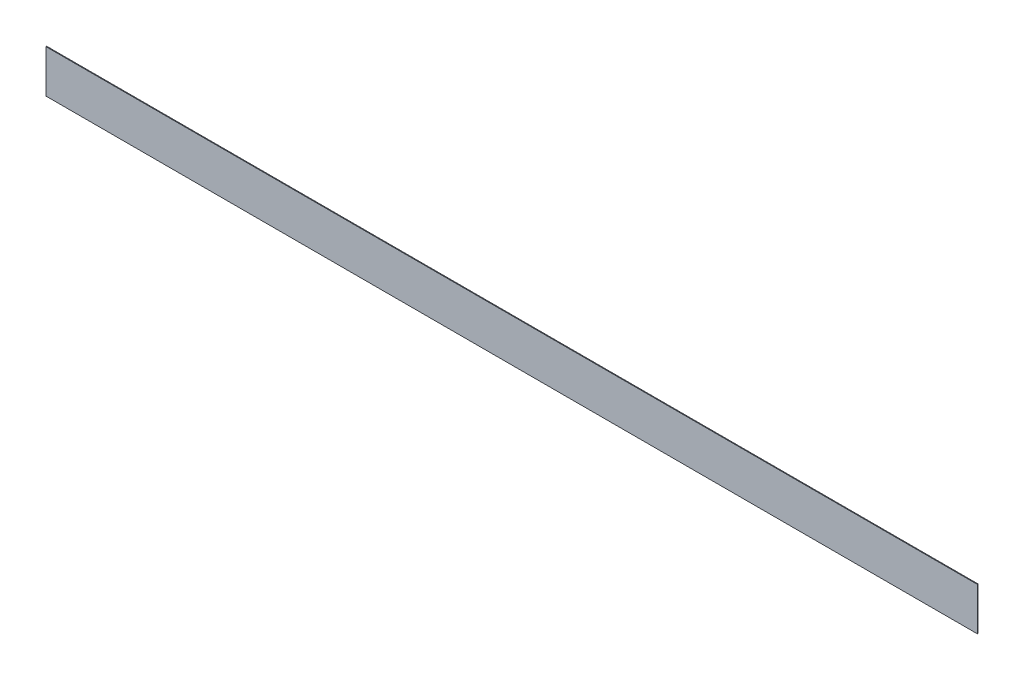
ISO-10303-21;
HEADER;
FILE_DESCRIPTION(('STEP AP214'),'2;1');
FILE_NAME('part.step','',(''),(''),'','','');
FILE_SCHEMA(('AUTOMOTIVE_DESIGN { 1 0 10303 214 1 1 1 1 }'));
ENDSEC;
DATA;
#1=APPLICATION_CONTEXT('core data for automotive mechanical design processes');
#2=APPLICATION_PROTOCOL_DEFINITION('international standard','automotive_design',2000,#1);
#3=PRODUCT_CONTEXT('',#1,'mechanical');
#4=PRODUCT('Part','Part','',(#3));
#5=PRODUCT_RELATED_PRODUCT_CATEGORY('part','',(#4));
#6=PRODUCT_DEFINITION_FORMATION('','',#4);
#7=PRODUCT_DEFINITION_CONTEXT('part definition',#1,'design');
#8=PRODUCT_DEFINITION('design','',#6,#7);
#9=PRODUCT_DEFINITION_SHAPE('','',#8);
#10=(LENGTH_UNIT() NAMED_UNIT(*) SI_UNIT(.MILLI.,.METRE.));
#11=(NAMED_UNIT(*) PLANE_ANGLE_UNIT() SI_UNIT($,.RADIAN.));
#12=(NAMED_UNIT(*) SI_UNIT($,.STERADIAN.) SOLID_ANGLE_UNIT());
#13=UNCERTAINTY_MEASURE_WITH_UNIT(LENGTH_MEASURE(1.E-05),#10,'distance_accuracy_value','');
#14=(GEOMETRIC_REPRESENTATION_CONTEXT(3) GLOBAL_UNCERTAINTY_ASSIGNED_CONTEXT((#13)) GLOBAL_UNIT_ASSIGNED_CONTEXT((#10,
#11,#12)) REPRESENTATION_CONTEXT('',''));
#15=CARTESIAN_POINT('',(0.,0.,0.));
#16=DIRECTION('',(0.,0.,1.));
#17=DIRECTION('',(1.,0.,0.));
#18=AXIS2_PLACEMENT_3D('',#15,#16,#17);
#19=CARTESIAN_POINT('',(2500.,115.,2.));
#20=DIRECTION('',(0.,-1.,0.));
#21=DIRECTION('',(1.,0.,0.));
#22=AXIS2_PLACEMENT_3D('',#19,#20,#21);
#23=PLANE('',#22);
#24=DIRECTION('',(-1.,0.,0.));
#25=VECTOR('',#24,1.);
#26=CARTESIAN_POINT('',(2500.,115.,0.));
#27=LINE('',#26,#25);
#28=CARTESIAN_POINT('',(2500.,115.,0.));
#29=VERTEX_POINT('',#28);
#30=CARTESIAN_POINT('',(0.,115.,0.));
#31=VERTEX_POINT('',#30);
#32=EDGE_CURVE('E109',#29,#31,#27,.T.);
#33=ORIENTED_EDGE('',*,*,#32,.T.);
#34=DIRECTION('',(0.,0.,-1.));
#35=VECTOR('',#34,1.);
#36=CARTESIAN_POINT('',(0.,115.,2.));
#37=LINE('',#36,#35);
#38=CARTESIAN_POINT('',(0.,115.,2.));
#39=VERTEX_POINT('',#38);
#40=EDGE_CURVE('E11',#39,#31,#37,.T.);
#41=ORIENTED_EDGE('',*,*,#40,.F.);
#42=DIRECTION('',(-1.,0.,0.));
#43=VECTOR('',#42,1.);
#44=CARTESIAN_POINT('',(2500.,115.,2.));
#45=LINE('',#44,#43);
#46=CARTESIAN_POINT('',(2500.,115.,2.));
#47=VERTEX_POINT('',#46);
#48=EDGE_CURVE('E93',#47,#39,#45,.T.);
#49=ORIENTED_EDGE('',*,*,#48,.F.);
#50=DIRECTION('',(0.,0.,-1.));
#51=VECTOR('',#50,1.);
#52=CARTESIAN_POINT('',(2500.,115.,2.));
#53=LINE('',#52,#51);
#54=EDGE_CURVE('E105',#47,#29,#53,.T.);
#55=ORIENTED_EDGE('',*,*,#54,.T.);
#56=EDGE_LOOP('',(#33,#41,#49,#55));
#57=FACE_BOUND('',#56,.T.);
#58=ADVANCED_FACE('F41',(#57),#23,.F.);
#59=CARTESIAN_POINT('',(0.,115.,2.));
#60=DIRECTION('',(1.,0.,0.));
#61=DIRECTION('',(0.,1.,0.));
#62=AXIS2_PLACEMENT_3D('',#59,#60,#61);
#63=PLANE('',#62);
#64=DIRECTION('',(0.,-1.,0.));
#65=VECTOR('',#64,1.);
#66=CARTESIAN_POINT('',(0.,115.,0.));
#67=LINE('',#66,#65);
#68=CARTESIAN_POINT('',(0.,0.,0.));
#69=VERTEX_POINT('',#68);
#70=EDGE_CURVE('E98',#31,#69,#67,.T.);
#71=ORIENTED_EDGE('',*,*,#70,.T.);
#72=DIRECTION('',(0.,0.,-1.));
#73=VECTOR('',#72,1.);
#74=CARTESIAN_POINT('',(0.,0.,2.));
#75=LINE('',#74,#73);
#76=CARTESIAN_POINT('',(0.,0.,2.));
#77=VERTEX_POINT('',#76);
#78=EDGE_CURVE('E50',#77,#69,#75,.T.);
#79=ORIENTED_EDGE('',*,*,#78,.F.);
#80=DIRECTION('',(0.,-1.,0.));
#81=VECTOR('',#80,1.);
#82=CARTESIAN_POINT('',(0.,115.,2.));
#83=LINE('',#82,#81);
#84=EDGE_CURVE('E88',#39,#77,#83,.T.);
#85=ORIENTED_EDGE('',*,*,#84,.F.);
#86=ORIENTED_EDGE('',*,*,#40,.T.);
#87=EDGE_LOOP('',(#71,#79,#85,#86));
#88=FACE_BOUND('',#87,.T.);
#89=ADVANCED_FACE('F97',(#88),#63,.F.);
#90=CARTESIAN_POINT('',(2500.,4.59242549680257E-13,2.));
#91=DIRECTION('',(0.,1.,0.));
#92=DIRECTION('',(-1.,0.,0.));
#93=AXIS2_PLACEMENT_3D('',#90,#91,#92);
#94=PLANE('',#93);
#95=DIRECTION('',(1.,0.,0.));
#96=VECTOR('',#95,1.);
#97=CARTESIAN_POINT('',(2500.,4.59242549680257E-13,0.));
#98=LINE('',#97,#96);
#99=CARTESIAN_POINT('',(2500.,4.59242549680257E-13,0.));
#100=VERTEX_POINT('',#99);
#101=EDGE_CURVE('E75',#69,#100,#98,.T.);
#102=ORIENTED_EDGE('',*,*,#101,.T.);
#103=DIRECTION('',(0.,0.,-1.));
#104=VECTOR('',#103,1.);
#105=CARTESIAN_POINT('',(2500.,4.59242549680257E-13,2.));
#106=LINE('',#105,#104);
#107=CARTESIAN_POINT('',(2500.,4.59242549680257E-13,2.));
#108=VERTEX_POINT('',#107);
#109=EDGE_CURVE('E100',#108,#100,#106,.T.);
#110=ORIENTED_EDGE('',*,*,#109,.F.);
#111=DIRECTION('',(1.,0.,0.));
#112=VECTOR('',#111,1.);
#113=CARTESIAN_POINT('',(2500.,4.59242549680257E-13,2.));
#114=LINE('',#113,#112);
#115=EDGE_CURVE('E91',#77,#108,#114,.T.);
#116=ORIENTED_EDGE('',*,*,#115,.F.);
#117=ORIENTED_EDGE('',*,*,#78,.T.);
#118=EDGE_LOOP('',(#102,#110,#116,#117));
#119=FACE_BOUND('',#118,.T.);
#120=ADVANCED_FACE('F101',(#119),#94,.F.);
#121=CARTESIAN_POINT('',(2500.,115.,2.));
#122=DIRECTION('',(-1.,0.,0.));
#123=DIRECTION('',(0.,0.,1.));
#124=AXIS2_PLACEMENT_3D('',#121,#122,#123);
#125=PLANE('',#124);
#126=DIRECTION('',(0.,1.,0.));
#127=VECTOR('',#126,1.);
#128=CARTESIAN_POINT('',(2500.,115.,0.));
#129=LINE('',#128,#127);
#130=EDGE_CURVE('E81',#100,#29,#129,.T.);
#131=ORIENTED_EDGE('',*,*,#130,.T.);
#132=ORIENTED_EDGE('',*,*,#54,.F.);
#133=DIRECTION('',(0.,1.,0.));
#134=VECTOR('',#133,1.);
#135=CARTESIAN_POINT('',(2500.,115.,2.));
#136=LINE('',#135,#134);
#137=EDGE_CURVE('E58',#108,#47,#136,.T.);
#138=ORIENTED_EDGE('',*,*,#137,.F.);
#139=ORIENTED_EDGE('',*,*,#109,.T.);
#140=EDGE_LOOP('',(#131,#132,#138,#139));
#141=FACE_BOUND('',#140,.T.);
#142=ADVANCED_FACE('F122',(#141),#125,.F.);
#143=CARTESIAN_POINT('',(0.,0.,2.));
#144=DIRECTION('',(0.,0.,1.));
#145=DIRECTION('',(1.,0.,0.));
#146=AXIS2_PLACEMENT_3D('',#143,#144,#145);
#147=PLANE('',#146);
#148=ORIENTED_EDGE('',*,*,#48,.T.);
#149=ORIENTED_EDGE('',*,*,#84,.T.);
#150=ORIENTED_EDGE('',*,*,#115,.T.);
#151=ORIENTED_EDGE('',*,*,#137,.T.);
#152=EDGE_LOOP('',(#148,#149,#150,#151));
#153=FACE_BOUND('',#152,.T.);
#154=ADVANCED_FACE('F89',(#153),#147,.T.);
#155=CARTESIAN_POINT('',(0.,0.,0.));
#156=DIRECTION('',(0.,0.,1.));
#157=DIRECTION('',(1.,0.,0.));
#158=AXIS2_PLACEMENT_3D('',#155,#156,#157);
#159=PLANE('',#158);
#160=ORIENTED_EDGE('',*,*,#32,.F.);
#161=ORIENTED_EDGE('',*,*,#130,.F.);
#162=ORIENTED_EDGE('',*,*,#101,.F.);
#163=ORIENTED_EDGE('',*,*,#70,.F.);
#164=EDGE_LOOP('',(#160,#161,#162,#163));
#165=FACE_BOUND('',#164,.T.);
#166=ADVANCED_FACE('F125',(#165),#159,.F.);
#167=CLOSED_SHELL('',(#58,#89,#120,#142,#154,#166));
#168=MANIFOLD_SOLID_BREP('B2',#167);
#169=ADVANCED_BREP_SHAPE_REPRESENTATION('',(#18,#168),#14);
#170=SHAPE_DEFINITION_REPRESENTATION(#9,#169);
ENDSEC;
END-ISO-10303-21;
